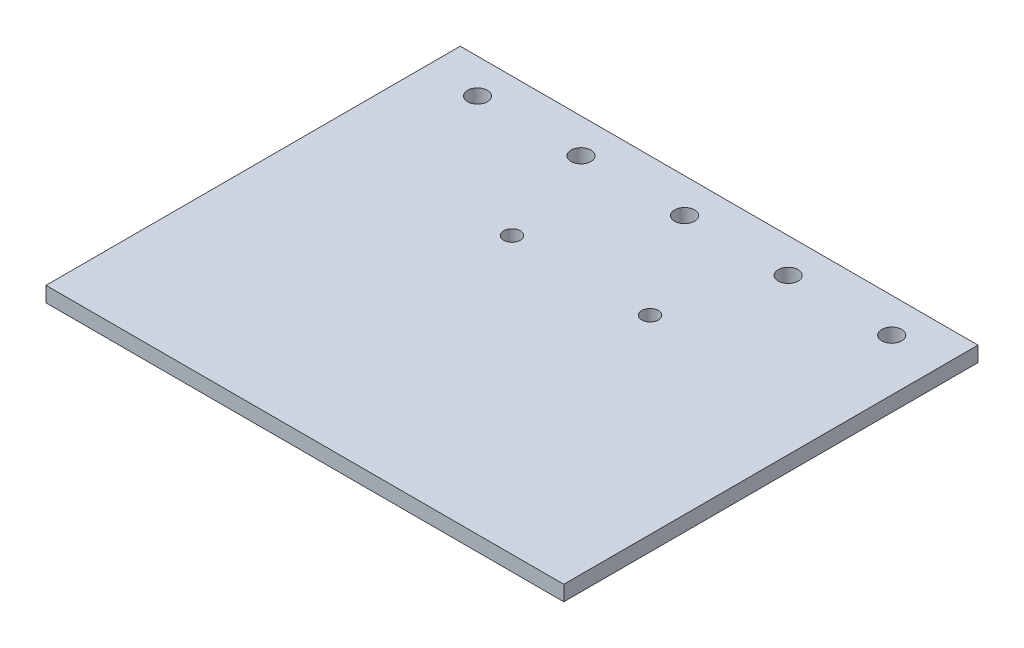
ISO-10303-21;
HEADER;
FILE_DESCRIPTION(('STEP AP214'),'2;1');
FILE_NAME('part.step','',(''),(''),'','','');
FILE_SCHEMA(('AUTOMOTIVE_DESIGN { 1 0 10303 214 1 1 1 1 }'));
ENDSEC;
DATA;
#1=APPLICATION_CONTEXT('core data for automotive mechanical design processes');
#2=APPLICATION_PROTOCOL_DEFINITION('international standard','automotive_design',2000,#1);
#3=PRODUCT_CONTEXT('',#1,'mechanical');
#4=PRODUCT('Part','Part','',(#3));
#5=PRODUCT_RELATED_PRODUCT_CATEGORY('part','',(#4));
#6=PRODUCT_DEFINITION_FORMATION('','',#4);
#7=PRODUCT_DEFINITION_CONTEXT('part definition',#1,'design');
#8=PRODUCT_DEFINITION('design','',#6,#7);
#9=PRODUCT_DEFINITION_SHAPE('','',#8);
#10=(LENGTH_UNIT() NAMED_UNIT(*) SI_UNIT(.MILLI.,.METRE.));
#11=(NAMED_UNIT(*) PLANE_ANGLE_UNIT() SI_UNIT($,.RADIAN.));
#12=(NAMED_UNIT(*) SI_UNIT($,.STERADIAN.) SOLID_ANGLE_UNIT());
#13=UNCERTAINTY_MEASURE_WITH_UNIT(LENGTH_MEASURE(1.E-05),#10,'distance_accuracy_value','');
#14=(GEOMETRIC_REPRESENTATION_CONTEXT(3) GLOBAL_UNCERTAINTY_ASSIGNED_CONTEXT((#13)) GLOBAL_UNIT_ASSIGNED_CONTEXT((#10,
#11,#12)) REPRESENTATION_CONTEXT('',''));
#15=CARTESIAN_POINT('',(0.,0.,0.));
#16=DIRECTION('',(0.,0.,1.));
#17=DIRECTION('',(1.,0.,0.));
#18=AXIS2_PLACEMENT_3D('',#15,#16,#17);
#19=CARTESIAN_POINT('',(47.625,2.794,-38.1));
#20=DIRECTION('',(-1.,0.,0.));
#21=DIRECTION('',(0.,0.,1.));
#22=AXIS2_PLACEMENT_3D('',#19,#20,#21);
#23=PLANE('',#22);
#24=DIRECTION('',(0.,0.,-1.));
#25=VECTOR('',#24,1.);
#26=CARTESIAN_POINT('',(47.625,0.,-38.1));
#27=LINE('',#26,#25);
#28=CARTESIAN_POINT('',(47.625,0.,38.1));
#29=VERTEX_POINT('',#28);
#30=CARTESIAN_POINT('',(47.625,0.,-38.1));
#31=VERTEX_POINT('',#30);
#32=EDGE_CURVE('E106',#29,#31,#27,.T.);
#33=ORIENTED_EDGE('',*,*,#32,.T.);
#34=DIRECTION('',(0.,-1.,0.));
#35=VECTOR('',#34,1.);
#36=CARTESIAN_POINT('',(47.625,2.794,-38.1));
#37=LINE('',#36,#35);
#38=CARTESIAN_POINT('',(47.625,2.794,-38.1));
#39=VERTEX_POINT('',#38);
#40=EDGE_CURVE('E11',#39,#31,#37,.T.);
#41=ORIENTED_EDGE('',*,*,#40,.F.);
#42=DIRECTION('',(0.,0.,-1.));
#43=VECTOR('',#42,1.);
#44=CARTESIAN_POINT('',(47.625,2.794,-38.1));
#45=LINE('',#44,#43);
#46=CARTESIAN_POINT('',(47.625,2.794,38.1));
#47=VERTEX_POINT('',#46);
#48=EDGE_CURVE('E90',#47,#39,#45,.T.);
#49=ORIENTED_EDGE('',*,*,#48,.F.);
#50=DIRECTION('',(0.,-1.,0.));
#51=VECTOR('',#50,1.);
#52=CARTESIAN_POINT('',(47.625,2.794,38.1));
#53=LINE('',#52,#51);
#54=EDGE_CURVE('E102',#47,#29,#53,.T.);
#55=ORIENTED_EDGE('',*,*,#54,.T.);
#56=EDGE_LOOP('',(#33,#41,#49,#55));
#57=FACE_BOUND('',#56,.T.);
#58=ADVANCED_FACE('F38',(#57),#23,.F.);
#59=CARTESIAN_POINT('',(-47.625,2.794,-38.1));
#60=DIRECTION('',(0.,0.,1.));
#61=DIRECTION('',(1.,0.,0.));
#62=AXIS2_PLACEMENT_3D('',#59,#60,#61);
#63=PLANE('',#62);
#64=DIRECTION('',(-1.,0.,0.));
#65=VECTOR('',#64,1.);
#66=CARTESIAN_POINT('',(-47.625,0.,-38.1));
#67=LINE('',#66,#65);
#68=CARTESIAN_POINT('',(-47.625,0.,-38.1));
#69=VERTEX_POINT('',#68);
#70=EDGE_CURVE('E95',#31,#69,#67,.T.);
#71=ORIENTED_EDGE('',*,*,#70,.T.);
#72=DIRECTION('',(0.,-1.,0.));
#73=VECTOR('',#72,1.);
#74=CARTESIAN_POINT('',(-47.625,2.794,-38.1));
#75=LINE('',#74,#73);
#76=CARTESIAN_POINT('',(-47.625,2.794,-38.1));
#77=VERTEX_POINT('',#76);
#78=EDGE_CURVE('E47',#77,#69,#75,.T.);
#79=ORIENTED_EDGE('',*,*,#78,.F.);
#80=DIRECTION('',(-1.,0.,0.));
#81=VECTOR('',#80,1.);
#82=CARTESIAN_POINT('',(-47.625,2.794,-38.1));
#83=LINE('',#82,#81);
#84=EDGE_CURVE('E85',#39,#77,#83,.T.);
#85=ORIENTED_EDGE('',*,*,#84,.F.);
#86=ORIENTED_EDGE('',*,*,#40,.T.);
#87=EDGE_LOOP('',(#71,#79,#85,#86));
#88=FACE_BOUND('',#87,.T.);
#89=ADVANCED_FACE('F94',(#88),#63,.F.);
#90=CARTESIAN_POINT('',(-47.625,2.794,-38.1));
#91=DIRECTION('',(1.,0.,0.));
#92=DIRECTION('',(0.,0.,-1.));
#93=AXIS2_PLACEMENT_3D('',#90,#91,#92);
#94=PLANE('',#93);
#95=DIRECTION('',(0.,0.,1.));
#96=VECTOR('',#95,1.);
#97=CARTESIAN_POINT('',(-47.625,0.,-38.1));
#98=LINE('',#97,#96);
#99=CARTESIAN_POINT('',(-47.625,0.,38.1));
#100=VERTEX_POINT('',#99);
#101=EDGE_CURVE('E72',#69,#100,#98,.T.);
#102=ORIENTED_EDGE('',*,*,#101,.T.);
#103=DIRECTION('',(0.,-1.,0.));
#104=VECTOR('',#103,1.);
#105=CARTESIAN_POINT('',(-47.625,2.794,38.1));
#106=LINE('',#105,#104);
#107=CARTESIAN_POINT('',(-47.625,2.794,38.1));
#108=VERTEX_POINT('',#107);
#109=EDGE_CURVE('E97',#108,#100,#106,.T.);
#110=ORIENTED_EDGE('',*,*,#109,.F.);
#111=DIRECTION('',(0.,0.,1.));
#112=VECTOR('',#111,1.);
#113=CARTESIAN_POINT('',(-47.625,2.794,-38.1));
#114=LINE('',#113,#112);
#115=EDGE_CURVE('E88',#77,#108,#114,.T.);
#116=ORIENTED_EDGE('',*,*,#115,.F.);
#117=ORIENTED_EDGE('',*,*,#78,.T.);
#118=EDGE_LOOP('',(#102,#110,#116,#117));
#119=FACE_BOUND('',#118,.T.);
#120=ADVANCED_FACE('F98',(#119),#94,.F.);
#121=CARTESIAN_POINT('',(-47.625,2.794,38.1));
#122=DIRECTION('',(0.,0.,-1.));
#123=DIRECTION('',(-1.,0.,0.));
#124=AXIS2_PLACEMENT_3D('',#121,#122,#123);
#125=PLANE('',#124);
#126=DIRECTION('',(1.,0.,0.));
#127=VECTOR('',#126,1.);
#128=CARTESIAN_POINT('',(-47.625,0.,38.1));
#129=LINE('',#128,#127);
#130=EDGE_CURVE('E78',#100,#29,#129,.T.);
#131=ORIENTED_EDGE('',*,*,#130,.T.);
#132=ORIENTED_EDGE('',*,*,#54,.F.);
#133=DIRECTION('',(1.,0.,0.));
#134=VECTOR('',#133,1.);
#135=CARTESIAN_POINT('',(-47.625,2.794,38.1));
#136=LINE('',#135,#134);
#137=EDGE_CURVE('E55',#108,#47,#136,.T.);
#138=ORIENTED_EDGE('',*,*,#137,.F.);
#139=ORIENTED_EDGE('',*,*,#109,.T.);
#140=EDGE_LOOP('',(#131,#132,#138,#139));
#141=FACE_BOUND('',#140,.T.);
#142=ADVANCED_FACE('F120',(#141),#125,.F.);
#143=CARTESIAN_POINT('',(0.,2.794,0.));
#144=DIRECTION('',(0.,1.,0.));
#145=DIRECTION('',(0.,0.,1.));
#146=AXIS2_PLACEMENT_3D('',#143,#144,#145);
#147=PLANE('',#146);
#148=CARTESIAN_POINT('',(-12.7,2.794,-12.7));
#149=DIRECTION('',(0.,1.,0.));
#150=DIRECTION('',(0.,0.,1.));
#151=AXIS2_PLACEMENT_3D('',#148,#149,#150);
#152=CIRCLE('',#151,1.524);
#153=CARTESIAN_POINT('',(-12.7,2.794,-11.176));
#154=VERTEX_POINT('',#153);
#155=EDGE_CURVE('E175',#154,#154,#152,.T.);
#156=ORIENTED_EDGE('',*,*,#155,.F.);
#157=EDGE_LOOP('',(#156));
#158=FACE_BOUND('',#157,.T.);
#159=CARTESIAN_POINT('',(12.7,2.794,-12.7));
#160=DIRECTION('',(0.,1.,0.));
#161=DIRECTION('',(0.,0.,1.));
#162=AXIS2_PLACEMENT_3D('',#159,#160,#161);
#163=CIRCLE('',#162,1.524);
#164=CARTESIAN_POINT('',(12.7,2.794,-11.176));
#165=VERTEX_POINT('',#164);
#166=EDGE_CURVE('E167',#165,#165,#163,.T.);
#167=ORIENTED_EDGE('',*,*,#166,.F.);
#168=EDGE_LOOP('',(#167));
#169=FACE_BOUND('',#168,.T.);
#170=CARTESIAN_POINT('',(-38.1,2.794,-31.75));
#171=DIRECTION('',(0.,1.,0.));
#172=DIRECTION('',(0.,0.,1.));
#173=AXIS2_PLACEMENT_3D('',#170,#171,#172);
#174=CIRCLE('',#173,1.8288);
#175=CARTESIAN_POINT('',(-38.1,2.794,-29.9212));
#176=VERTEX_POINT('',#175);
#177=EDGE_CURVE('E160',#176,#176,#174,.T.);
#178=ORIENTED_EDGE('',*,*,#177,.F.);
#179=EDGE_LOOP('',(#178));
#180=FACE_BOUND('',#179,.T.);
#181=CARTESIAN_POINT('',(-19.05,2.794,-31.75));
#182=DIRECTION('',(0.,1.,0.));
#183=DIRECTION('',(0.,0.,1.));
#184=AXIS2_PLACEMENT_3D('',#181,#182,#183);
#185=CIRCLE('',#184,1.8288);
#186=CARTESIAN_POINT('',(-19.05,2.794,-29.9212));
#187=VERTEX_POINT('',#186);
#188=EDGE_CURVE('E152',#187,#187,#185,.T.);
#189=ORIENTED_EDGE('',*,*,#188,.F.);
#190=EDGE_LOOP('',(#189));
#191=FACE_BOUND('',#190,.T.);
#192=CARTESIAN_POINT('',(0.,2.794,-31.75));
#193=DIRECTION('',(0.,1.,0.));
#194=DIRECTION('',(0.,0.,1.));
#195=AXIS2_PLACEMENT_3D('',#192,#193,#194);
#196=CIRCLE('',#195,1.8288);
#197=CARTESIAN_POINT('',(0.,2.794,-29.9212));
#198=VERTEX_POINT('',#197);
#199=EDGE_CURVE('E144',#198,#198,#196,.T.);
#200=ORIENTED_EDGE('',*,*,#199,.F.);
#201=EDGE_LOOP('',(#200));
#202=FACE_BOUND('',#201,.T.);
#203=CARTESIAN_POINT('',(19.05,2.794,-31.75));
#204=DIRECTION('',(0.,1.,0.));
#205=DIRECTION('',(0.,0.,1.));
#206=AXIS2_PLACEMENT_3D('',#203,#204,#205);
#207=CIRCLE('',#206,1.8288);
#208=CARTESIAN_POINT('',(19.05,2.794,-29.9212));
#209=VERTEX_POINT('',#208);
#210=EDGE_CURVE('E136',#209,#209,#207,.T.);
#211=ORIENTED_EDGE('',*,*,#210,.F.);
#212=EDGE_LOOP('',(#211));
#213=FACE_BOUND('',#212,.T.);
#214=CARTESIAN_POINT('',(38.1,2.794,-31.75));
#215=DIRECTION('',(0.,1.,0.));
#216=DIRECTION('',(0.,0.,1.));
#217=AXIS2_PLACEMENT_3D('',#214,#215,#216);
#218=CIRCLE('',#217,1.8288);
#219=CARTESIAN_POINT('',(38.1,2.794,-29.9212));
#220=VERTEX_POINT('',#219);
#221=EDGE_CURVE('E127',#220,#220,#218,.T.);
#222=ORIENTED_EDGE('',*,*,#221,.F.);
#223=EDGE_LOOP('',(#222));
#224=FACE_BOUND('',#223,.T.);
#225=ORIENTED_EDGE('',*,*,#48,.T.);
#226=ORIENTED_EDGE('',*,*,#84,.T.);
#227=ORIENTED_EDGE('',*,*,#115,.T.);
#228=ORIENTED_EDGE('',*,*,#137,.T.);
#229=EDGE_LOOP('',(#225,#226,#227,#228));
#230=FACE_BOUND('',#229,.T.);
#231=ADVANCED_FACE('F86',(#158,#169,#180,#191,#202,#213,#224,#230),#147,.T.);
#232=CARTESIAN_POINT('',(0.,0.,0.));
#233=DIRECTION('',(0.,1.,0.));
#234=DIRECTION('',(0.,0.,1.));
#235=AXIS2_PLACEMENT_3D('',#232,#233,#234);
#236=PLANE('',#235);
#237=CARTESIAN_POINT('',(-12.7,0.,-12.7));
#238=DIRECTION('',(0.,1.,0.));
#239=DIRECTION('',(0.,0.,1.));
#240=AXIS2_PLACEMENT_3D('',#237,#238,#239);
#241=CIRCLE('',#240,1.524);
#242=CARTESIAN_POINT('',(-12.7,0.,-11.176));
#243=VERTEX_POINT('',#242);
#244=EDGE_CURVE('E132',#243,#243,#241,.T.);
#245=ORIENTED_EDGE('',*,*,#244,.T.);
#246=EDGE_LOOP('',(#245));
#247=FACE_BOUND('',#246,.T.);
#248=CARTESIAN_POINT('',(12.7,0.,-12.7));
#249=DIRECTION('',(0.,1.,0.));
#250=DIRECTION('',(0.,0.,1.));
#251=AXIS2_PLACEMENT_3D('',#248,#249,#250);
#252=CIRCLE('',#251,1.524);
#253=CARTESIAN_POINT('',(12.7,0.,-11.176));
#254=VERTEX_POINT('',#253);
#255=EDGE_CURVE('E171',#254,#254,#252,.T.);
#256=ORIENTED_EDGE('',*,*,#255,.T.);
#257=EDGE_LOOP('',(#256));
#258=FACE_BOUND('',#257,.T.);
#259=CARTESIAN_POINT('',(-38.1,0.,-31.75));
#260=DIRECTION('',(0.,1.,0.));
#261=DIRECTION('',(0.,0.,1.));
#262=AXIS2_PLACEMENT_3D('',#259,#260,#261);
#263=CIRCLE('',#262,1.8288);
#264=CARTESIAN_POINT('',(-38.1,0.,-29.9212));
#265=VERTEX_POINT('',#264);
#266=EDGE_CURVE('E110',#265,#265,#263,.T.);
#267=ORIENTED_EDGE('',*,*,#266,.T.);
#268=EDGE_LOOP('',(#267));
#269=FACE_BOUND('',#268,.T.);
#270=CARTESIAN_POINT('',(-19.05,0.,-31.75));
#271=DIRECTION('',(0.,1.,0.));
#272=DIRECTION('',(0.,0.,1.));
#273=AXIS2_PLACEMENT_3D('',#270,#271,#272);
#274=CIRCLE('',#273,1.8288);
#275=CARTESIAN_POINT('',(-19.05,0.,-29.9212));
#276=VERTEX_POINT('',#275);
#277=EDGE_CURVE('E156',#276,#276,#274,.T.);
#278=ORIENTED_EDGE('',*,*,#277,.T.);
#279=EDGE_LOOP('',(#278));
#280=FACE_BOUND('',#279,.T.);
#281=CARTESIAN_POINT('',(0.,0.,-31.75));
#282=DIRECTION('',(0.,1.,0.));
#283=DIRECTION('',(0.,0.,1.));
#284=AXIS2_PLACEMENT_3D('',#281,#282,#283);
#285=CIRCLE('',#284,1.8288);
#286=CARTESIAN_POINT('',(0.,0.,-29.9212));
#287=VERTEX_POINT('',#286);
#288=EDGE_CURVE('E148',#287,#287,#285,.T.);
#289=ORIENTED_EDGE('',*,*,#288,.T.);
#290=EDGE_LOOP('',(#289));
#291=FACE_BOUND('',#290,.T.);
#292=CARTESIAN_POINT('',(19.05,0.,-31.75));
#293=DIRECTION('',(0.,1.,0.));
#294=DIRECTION('',(0.,0.,1.));
#295=AXIS2_PLACEMENT_3D('',#292,#293,#294);
#296=CIRCLE('',#295,1.8288);
#297=CARTESIAN_POINT('',(19.05,0.,-29.9212));
#298=VERTEX_POINT('',#297);
#299=EDGE_CURVE('E140',#298,#298,#296,.T.);
#300=ORIENTED_EDGE('',*,*,#299,.T.);
#301=EDGE_LOOP('',(#300));
#302=FACE_BOUND('',#301,.T.);
#303=CARTESIAN_POINT('',(38.1,0.,-31.75));
#304=DIRECTION('',(0.,1.,0.));
#305=DIRECTION('',(0.,0.,1.));
#306=AXIS2_PLACEMENT_3D('',#303,#304,#305);
#307=CIRCLE('',#306,1.8288);
#308=CARTESIAN_POINT('',(38.1,0.,-29.9212));
#309=VERTEX_POINT('',#308);
#310=EDGE_CURVE('E131',#309,#309,#307,.T.);
#311=ORIENTED_EDGE('',*,*,#310,.T.);
#312=EDGE_LOOP('',(#311));
#313=FACE_BOUND('',#312,.T.);
#314=ORIENTED_EDGE('',*,*,#32,.F.);
#315=ORIENTED_EDGE('',*,*,#130,.F.);
#316=ORIENTED_EDGE('',*,*,#101,.F.);
#317=ORIENTED_EDGE('',*,*,#70,.F.);
#318=EDGE_LOOP('',(#314,#315,#316,#317));
#319=FACE_BOUND('',#318,.T.);
#320=ADVANCED_FACE('F123',(#247,#258,#269,#280,#291,#302,#313,#319),#236,.F.);
#321=CARTESIAN_POINT('',(38.1,0.,-31.75));
#322=DIRECTION('',(0.,1.,0.));
#323=DIRECTION('',(0.,0.,1.));
#324=AXIS2_PLACEMENT_3D('',#321,#322,#323);
#325=CYLINDRICAL_SURFACE('',#324,1.8288);
#326=ORIENTED_EDGE('',*,*,#310,.F.);
#327=EDGE_LOOP('',(#326));
#328=FACE_BOUND('',#327,.T.);
#329=ORIENTED_EDGE('',*,*,#221,.T.);
#330=EDGE_LOOP('',(#329));
#331=FACE_BOUND('',#330,.T.);
#332=ADVANCED_FACE('F207',(#328,#331),#325,.F.);
#333=CARTESIAN_POINT('',(19.05,0.,-31.75));
#334=DIRECTION('',(0.,1.,0.));
#335=DIRECTION('',(0.,0.,1.));
#336=AXIS2_PLACEMENT_3D('',#333,#334,#335);
#337=CYLINDRICAL_SURFACE('',#336,1.8288);
#338=ORIENTED_EDGE('',*,*,#299,.F.);
#339=EDGE_LOOP('',(#338));
#340=FACE_BOUND('',#339,.T.);
#341=ORIENTED_EDGE('',*,*,#210,.T.);
#342=EDGE_LOOP('',(#341));
#343=FACE_BOUND('',#342,.T.);
#344=ADVANCED_FACE('F209',(#340,#343),#337,.F.);
#345=CARTESIAN_POINT('',(0.,0.,-31.75));
#346=DIRECTION('',(0.,1.,0.));
#347=DIRECTION('',(0.,0.,1.));
#348=AXIS2_PLACEMENT_3D('',#345,#346,#347);
#349=CYLINDRICAL_SURFACE('',#348,1.8288);
#350=ORIENTED_EDGE('',*,*,#288,.F.);
#351=EDGE_LOOP('',(#350));
#352=FACE_BOUND('',#351,.T.);
#353=ORIENTED_EDGE('',*,*,#199,.T.);
#354=EDGE_LOOP('',(#353));
#355=FACE_BOUND('',#354,.T.);
#356=ADVANCED_FACE('F216',(#352,#355),#349,.F.);
#357=CARTESIAN_POINT('',(-19.05,0.,-31.75));
#358=DIRECTION('',(0.,1.,0.));
#359=DIRECTION('',(0.,0.,1.));
#360=AXIS2_PLACEMENT_3D('',#357,#358,#359);
#361=CYLINDRICAL_SURFACE('',#360,1.8288);
#362=ORIENTED_EDGE('',*,*,#277,.F.);
#363=EDGE_LOOP('',(#362));
#364=FACE_BOUND('',#363,.T.);
#365=ORIENTED_EDGE('',*,*,#188,.T.);
#366=EDGE_LOOP('',(#365));
#367=FACE_BOUND('',#366,.T.);
#368=ADVANCED_FACE('F271',(#364,#367),#361,.F.);
#369=CARTESIAN_POINT('',(-38.1,0.,-31.75));
#370=DIRECTION('',(0.,1.,0.));
#371=DIRECTION('',(0.,0.,1.));
#372=AXIS2_PLACEMENT_3D('',#369,#370,#371);
#373=CYLINDRICAL_SURFACE('',#372,1.8288);
#374=ORIENTED_EDGE('',*,*,#266,.F.);
#375=EDGE_LOOP('',(#374));
#376=FACE_BOUND('',#375,.T.);
#377=ORIENTED_EDGE('',*,*,#177,.T.);
#378=EDGE_LOOP('',(#377));
#379=FACE_BOUND('',#378,.T.);
#380=ADVANCED_FACE('F256',(#376,#379),#373,.F.);
#381=CARTESIAN_POINT('',(12.7,0.,-12.7));
#382=DIRECTION('',(0.,1.,0.));
#383=DIRECTION('',(0.,0.,1.));
#384=AXIS2_PLACEMENT_3D('',#381,#382,#383);
#385=CYLINDRICAL_SURFACE('',#384,1.524);
#386=ORIENTED_EDGE('',*,*,#255,.F.);
#387=EDGE_LOOP('',(#386));
#388=FACE_BOUND('',#387,.T.);
#389=ORIENTED_EDGE('',*,*,#166,.T.);
#390=EDGE_LOOP('',(#389));
#391=FACE_BOUND('',#390,.T.);
#392=ADVANCED_FACE('F188',(#388,#391),#385,.F.);
#393=CARTESIAN_POINT('',(-12.7,0.,-12.7));
#394=DIRECTION('',(0.,1.,0.));
#395=DIRECTION('',(0.,0.,1.));
#396=AXIS2_PLACEMENT_3D('',#393,#394,#395);
#397=CYLINDRICAL_SURFACE('',#396,1.524);
#398=ORIENTED_EDGE('',*,*,#244,.F.);
#399=EDGE_LOOP('',(#398));
#400=FACE_BOUND('',#399,.T.);
#401=ORIENTED_EDGE('',*,*,#155,.T.);
#402=EDGE_LOOP('',(#401));
#403=FACE_BOUND('',#402,.T.);
#404=ADVANCED_FACE('F185',(#400,#403),#397,.F.);
#405=CLOSED_SHELL('',(#58,#89,#120,#142,#231,#320,#332,#344,#356,#368,#380,#392,#404));
#406=MANIFOLD_SOLID_BREP('B2',#405);
#407=ADVANCED_BREP_SHAPE_REPRESENTATION('',(#18,#406),#14);
#408=SHAPE_DEFINITION_REPRESENTATION(#9,#407);
ENDSEC;
END-ISO-10303-21;
